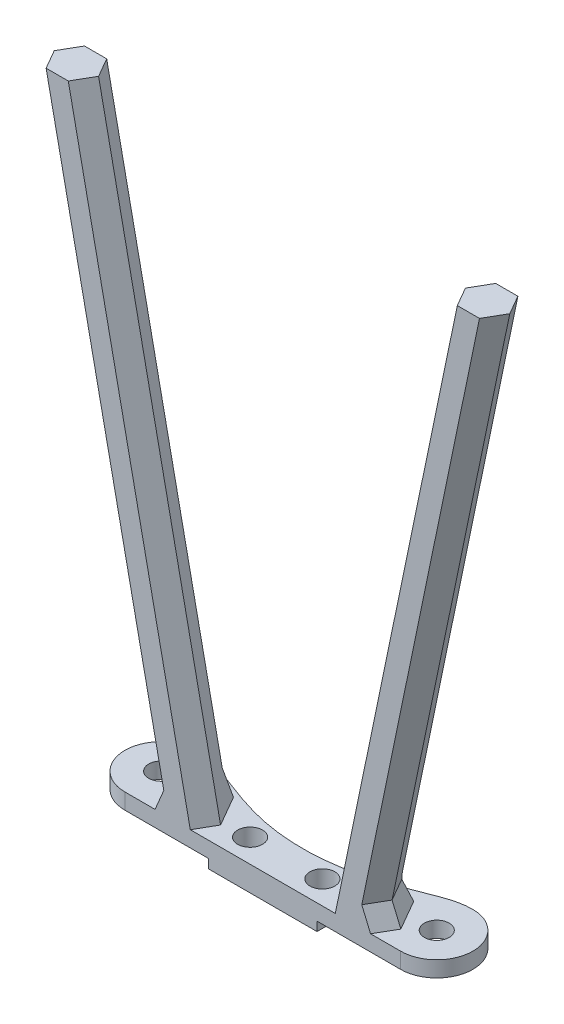
ISO-10303-21;
HEADER;
FILE_DESCRIPTION(('STEP AP214'),'2;1');
FILE_NAME('part.step','',(''),(''),'','','');
FILE_SCHEMA(('AUTOMOTIVE_DESIGN { 1 0 10303 214 1 1 1 1 }'));
ENDSEC;
DATA;
#1=APPLICATION_CONTEXT('core data for automotive mechanical design processes');
#2=APPLICATION_PROTOCOL_DEFINITION('international standard','automotive_design',2000,#1);
#3=PRODUCT_CONTEXT('',#1,'mechanical');
#4=PRODUCT('Part','Part','',(#3));
#5=PRODUCT_RELATED_PRODUCT_CATEGORY('part','',(#4));
#6=PRODUCT_DEFINITION_FORMATION('','',#4);
#7=PRODUCT_DEFINITION_CONTEXT('part definition',#1,'design');
#8=PRODUCT_DEFINITION('design','',#6,#7);
#9=PRODUCT_DEFINITION_SHAPE('','',#8);
#10=(LENGTH_UNIT() NAMED_UNIT(*) SI_UNIT(.MILLI.,.METRE.));
#11=(NAMED_UNIT(*) PLANE_ANGLE_UNIT() SI_UNIT($,.RADIAN.));
#12=(NAMED_UNIT(*) SI_UNIT($,.STERADIAN.) SOLID_ANGLE_UNIT());
#13=UNCERTAINTY_MEASURE_WITH_UNIT(LENGTH_MEASURE(1.E-05),#10,'distance_accuracy_value','');
#14=(GEOMETRIC_REPRESENTATION_CONTEXT(3) GLOBAL_UNCERTAINTY_ASSIGNED_CONTEXT((#13)) GLOBAL_UNIT_ASSIGNED_CONTEXT((#10,
#11,#12)) REPRESENTATION_CONTEXT('',''));
#15=CARTESIAN_POINT('',(0.,0.,0.));
#16=DIRECTION('',(0.,0.,1.));
#17=DIRECTION('',(1.,0.,0.));
#18=AXIS2_PLACEMENT_3D('',#15,#16,#17);
#19=CARTESIAN_POINT('',(0.,0.,0.));
#20=DIRECTION('',(0.,1.00000000000001,0.));
#21=DIRECTION('',(0.,0.,1.));
#22=AXIS2_PLACEMENT_3D('',#19,#20,#21);
#23=PLANE('',#22);
#24=CARTESIAN_POINT('',(30.5000000000002,0.,0.));
#25=DIRECTION('',(0.,1.00000000000001,0.));
#26=DIRECTION('',(0.,0.,1.));
#27=AXIS2_PLACEMENT_3D('',#24,#25,#26);
#28=CIRCLE('',#27,1.375);
#29=CARTESIAN_POINT('',(30.5000000000002,0.,1.375));
#30=VERTEX_POINT('',#29);
#31=EDGE_CURVE('E552',#30,#30,#28,.T.);
#32=ORIENTED_EDGE('',*,*,#31,.T.);
#33=EDGE_LOOP('',(#32));
#34=FACE_BOUND('',#33,.T.);
#35=DIRECTION('',(0.,0.,1.));
#36=VECTOR('',#35,1.);
#37=CARTESIAN_POINT('',(21.2500000000001,0.,4.));
#38=LINE('',#37,#36);
#39=CARTESIAN_POINT('',(21.2500000022778,0.,-1.18515930909376));
#40=VERTEX_POINT('',#39);
#41=CARTESIAN_POINT('',(21.25,0.,4.));
#42=VERTEX_POINT('',#41);
#43=EDGE_CURVE('E259',#40,#42,#38,.T.);
#44=ORIENTED_EDGE('',*,*,#43,.F.);
#45=CARTESIAN_POINT('',(0.,0.,-4.));
#46=CARTESIAN_POINT('',(1.39255410455017,0.,-4.));
#47=CARTESIAN_POINT('',(4.71281611874443,0.,-2.73030225078324));
#48=CARTESIAN_POINT('',(11.20008630874,0.,-0.212313893075119));
#49=CARTESIAN_POINT('',(19.2746966248634,0.,-0.212313893075119));
#50=CARTESIAN_POINT('',(25.8425779606497,0.,-2.73030225078324));
#51=CARTESIAN_POINT('',(29.028765437006,0.,-4.));
#52=CARTESIAN_POINT('',(30.5000000000002,0.,-4.));
#53=B_SPLINE_CURVE_WITH_KNOTS('',3,(#45,#46,#47,#48,#49,#50,#51,#52),.UNSPECIFIED.,.F.,.F.,(4,1,
1,1,1,4),(0.,0.131328662270549,0.332777634257892,0.667222365742108,0.868671337729451,1.),.UNSPECIFIED.);
#54=CARTESIAN_POINT('',(30.5000000000002,0.,-4.));
#55=VERTEX_POINT('',#54);
#56=EDGE_CURVE('E532',#40,#55,#53,.T.);
#57=ORIENTED_EDGE('',*,*,#56,.T.);
#58=CARTESIAN_POINT('',(30.5000000000002,0.,0.));
#59=DIRECTION('',(0.,1.00000000000001,0.));
#60=DIRECTION('',(0.,0.,1.));
#61=AXIS2_PLACEMENT_3D('',#58,#59,#60);
#62=CIRCLE('',#61,4.);
#63=CARTESIAN_POINT('',(30.5000000000002,0.,4.));
#64=VERTEX_POINT('',#63);
#65=EDGE_CURVE('E498',#64,#55,#62,.T.);
#66=ORIENTED_EDGE('',*,*,#65,.F.);
#67=DIRECTION('',(1.00000000000001,0.,0.));
#68=VECTOR('',#67,1.);
#69=CARTESIAN_POINT('',(0.,0.,4.));
#70=LINE('',#69,#68);
#71=EDGE_CURVE('E89',#42,#64,#70,.T.);
#72=ORIENTED_EDGE('',*,*,#71,.F.);
#73=EDGE_LOOP('',(#44,#57,#66,#72));
#74=FACE_BOUND('',#73,.T.);
#75=ADVANCED_FACE('F69',(#34,#74),#23,.F.);
#76=CARTESIAN_POINT('',(0.,0.,0.));
#77=DIRECTION('',(0.,1.00000000000001,0.));
#78=DIRECTION('',(0.,0.,1.));
#79=AXIS2_PLACEMENT_3D('',#76,#77,#78);
#80=CIRCLE('',#79,1.375);
#81=CARTESIAN_POINT('',(0.,0.,1.375));
#82=VERTEX_POINT('',#81);
#83=EDGE_CURVE('E569',#82,#82,#80,.T.);
#84=ORIENTED_EDGE('',*,*,#83,.T.);
#85=EDGE_LOOP('',(#84));
#86=FACE_BOUND('',#85,.T.);
#87=DIRECTION('',(0.,0.,-1.));
#88=VECTOR('',#87,1.);
#89=CARTESIAN_POINT('',(9.25000000000004,0.,4.));
#90=LINE('',#89,#88);
#91=CARTESIAN_POINT('',(9.25000000000026,0.,4.));
#92=VERTEX_POINT('',#91);
#93=CARTESIAN_POINT('',(9.25000000000049,0.,-1.18670499105833));
#94=VERTEX_POINT('',#93);
#95=EDGE_CURVE('E97',#92,#94,#90,.T.);
#96=ORIENTED_EDGE('',*,*,#95,.F.);
#97=CARTESIAN_POINT('',(0.,0.,4.));
#98=VERTEX_POINT('',#97);
#99=EDGE_CURVE('E263',#98,#92,#70,.T.);
#100=ORIENTED_EDGE('',*,*,#99,.F.);
#101=CARTESIAN_POINT('',(0.,0.,0.));
#102=DIRECTION('',(0.,1.00000000000001,0.));
#103=DIRECTION('',(0.,0.,1.));
#104=AXIS2_PLACEMENT_3D('',#101,#102,#103);
#105=CIRCLE('',#104,4.);
#106=CARTESIAN_POINT('',(0.,0.,-4.));
#107=VERTEX_POINT('',#106);
#108=EDGE_CURVE('E509',#107,#98,#105,.T.);
#109=ORIENTED_EDGE('',*,*,#108,.F.);
#110=EDGE_CURVE('E535',#107,#94,#53,.T.);
#111=ORIENTED_EDGE('',*,*,#110,.T.);
#112=EDGE_LOOP('',(#96,#100,#109,#111));
#113=FACE_BOUND('',#112,.T.);
#114=ADVANCED_FACE('F551',(#86,#113),#23,.F.);
#115=CARTESIAN_POINT('',(0.,1.75,0.));
#116=DIRECTION('',(0.,1.00000000000001,0.));
#117=DIRECTION('',(0.,0.,1.));
#118=AXIS2_PLACEMENT_3D('',#115,#116,#117);
#119=PLANE('',#118);
#120=CARTESIAN_POINT('',(11.2499999958525,1.75,1.40677631135101));
#121=DIRECTION('',(0.,1.00000000000001,0.));
#122=DIRECTION('',(0.,0.,1.));
#123=AXIS2_PLACEMENT_3D('',#120,#121,#122);
#124=CIRCLE('',#123,1.375);
#125=CARTESIAN_POINT('',(11.2499999958525,1.75,2.781776311351));
#126=VERTEX_POINT('',#125);
#127=EDGE_CURVE('E554',#126,#126,#124,.T.);
#128=ORIENTED_EDGE('',*,*,#127,.F.);
#129=EDGE_LOOP('',(#128));
#130=FACE_BOUND('',#129,.T.);
#131=CARTESIAN_POINT('',(19.2500000041476,1.75,1.4072915388733));
#132=DIRECTION('',(0.,1.00000000000001,0.));
#133=DIRECTION('',(0.,0.,1.));
#134=AXIS2_PLACEMENT_3D('',#131,#132,#133);
#135=CIRCLE('',#134,1.375);
#136=CARTESIAN_POINT('',(19.2500000041476,1.75,2.7822915388733));
#137=VERTEX_POINT('',#136);
#138=EDGE_CURVE('E610',#137,#137,#135,.T.);
#139=ORIENTED_EDGE('',*,*,#138,.F.);
#140=EDGE_LOOP('',(#139));
#141=FACE_BOUND('',#140,.T.);
#142=CARTESIAN_POINT('',(0.,1.75,0.));
#143=DIRECTION('',(0.,1.00000000000001,0.));
#144=DIRECTION('',(0.,0.,1.));
#145=AXIS2_PLACEMENT_3D('',#142,#143,#144);
#146=CIRCLE('',#145,1.375);
#147=CARTESIAN_POINT('',(0.,1.75,1.375));
#148=VERTEX_POINT('',#147);
#149=EDGE_CURVE('E511',#148,#148,#146,.T.);
#150=ORIENTED_EDGE('',*,*,#149,.F.);
#151=EDGE_LOOP('',(#150));
#152=FACE_BOUND('',#151,.T.);
#153=CARTESIAN_POINT('',(30.5000000000002,1.75,0.));
#154=DIRECTION('',(0.,1.00000000000001,0.));
#155=DIRECTION('',(0.,0.,1.));
#156=AXIS2_PLACEMENT_3D('',#153,#154,#155);
#157=CIRCLE('',#156,1.375);
#158=CARTESIAN_POINT('',(30.5000000000002,1.75,1.375));
#159=VERTEX_POINT('',#158);
#160=EDGE_CURVE('E562',#159,#159,#157,.T.);
#161=ORIENTED_EDGE('',*,*,#160,.F.);
#162=EDGE_LOOP('',(#161));
#163=FACE_BOUND('',#162,.T.);
#164=DIRECTION('',(0.500000000000003,0.,-0.866025403784439));
#165=VECTOR('',#164,1.);
#166=CARTESIAN_POINT('',(22.0462613559442,1.75,1.875));
#167=LINE('',#166,#165);
#168=CARTESIAN_POINT('',(22.0462613559442,1.75,1.87500000000001));
#169=VERTEX_POINT('',#168);
#170=CARTESIAN_POINT('',(23.9948185144593,1.75,-1.5));
#171=VERTEX_POINT('',#170);
#172=EDGE_CURVE('E412',#169,#171,#167,.T.);
#173=ORIENTED_EDGE('',*,*,#172,.T.);
#174=DIRECTION('',(1.00000000000001,0.,0.));
#175=VECTOR('',#174,1.);
#176=CARTESIAN_POINT('',(0.,1.75,-1.50000000000001));
#177=LINE('',#176,#175);
#178=CARTESIAN_POINT('',(26.4485571585151,1.75,-1.5));
#179=VERTEX_POINT('',#178);
#180=EDGE_CURVE('E950',#171,#179,#177,.T.);
#181=ORIENTED_EDGE('',*,*,#180,.T.);
#182=DIRECTION('',(0.500000000000003,0.,0.866025403784439));
#183=VECTOR('',#182,1.);
#184=CARTESIAN_POINT('',(20.4859369217246,1.75,-11.8275611963594));
#185=LINE('',#184,#183);
#186=CARTESIAN_POINT('',(28.3971143170301,1.75,1.87499999999999));
#187=VERTEX_POINT('',#186);
#188=EDGE_CURVE('E952',#179,#187,#185,.T.);
#189=ORIENTED_EDGE('',*,*,#188,.T.);
#190=DIRECTION('',(-0.500000000000003,0.,0.866025403784439));
#191=VECTOR('',#190,1.);
#192=CARTESIAN_POINT('',(22.1097345538205,1.75,12.7650611963594));
#193=LINE('',#192,#191);
#194=CARTESIAN_POINT('',(27.1702449950022,1.75,4.));
#195=VERTEX_POINT('',#194);
#196=EDGE_CURVE('E404',#187,#195,#193,.T.);
#197=ORIENTED_EDGE('',*,*,#196,.T.);
#198=DIRECTION('',(1.00000000000001,0.,0.));
#199=VECTOR('',#198,1.);
#200=CARTESIAN_POINT('',(0.,1.75,4.));
#201=LINE('',#200,#199);
#202=CARTESIAN_POINT('',(30.5000000000002,1.75,4.));
#203=VERTEX_POINT('',#202);
#204=EDGE_CURVE('E425',#195,#203,#201,.T.);
#205=ORIENTED_EDGE('',*,*,#204,.T.);
#206=CARTESIAN_POINT('',(30.5000000000002,1.75,0.));
#207=DIRECTION('',(0.,1.00000000000001,0.));
#208=DIRECTION('',(0.,0.,1.));
#209=AXIS2_PLACEMENT_3D('',#206,#207,#208);
#210=CIRCLE('',#209,4.);
#211=CARTESIAN_POINT('',(30.5000000000002,1.75,-4.));
#212=VERTEX_POINT('',#211);
#213=EDGE_CURVE('E506',#203,#212,#210,.T.);
#214=ORIENTED_EDGE('',*,*,#213,.T.);
#215=CARTESIAN_POINT('',(0.,1.75,-4.));
#216=CARTESIAN_POINT('',(1.39255410455017,1.75,-4.));
#217=CARTESIAN_POINT('',(4.71281611874443,1.75,-2.73030225078324));
#218=CARTESIAN_POINT('',(11.20008630874,1.75,-0.212313893075119));
#219=CARTESIAN_POINT('',(19.2746966248634,1.75,-0.212313893075119));
#220=CARTESIAN_POINT('',(25.8425779606497,1.75,-2.73030225078324));
#221=CARTESIAN_POINT('',(29.028765437006,1.75,-4.));
#222=CARTESIAN_POINT('',(30.5000000000002,1.75,-4.));
#223=B_SPLINE_CURVE_WITH_KNOTS('',3,(#215,#216,#217,#218,#219,#220,#221,#222),.UNSPECIFIED.,.F.,
.F.,(4,1,1,1,1,4),(0.,0.131328662270549,0.332777634257892,0.667222365742108,0.868671337729451,
1.),.UNSPECIFIED.);
#224=CARTESIAN_POINT('',(0.,1.75,-4.));
#225=VERTEX_POINT('',#224);
#226=EDGE_CURVE('E536',#225,#212,#223,.T.);
#227=ORIENTED_EDGE('',*,*,#226,.F.);
#228=CARTESIAN_POINT('',(0.,1.75,0.));
#229=DIRECTION('',(0.,1.00000000000001,0.));
#230=DIRECTION('',(0.,0.,1.));
#231=AXIS2_PLACEMENT_3D('',#228,#229,#230);
#232=CIRCLE('',#231,4.);
#233=CARTESIAN_POINT('',(0.,1.75,4.));
#234=VERTEX_POINT('',#233);
#235=EDGE_CURVE('E501',#225,#234,#232,.T.);
#236=ORIENTED_EDGE('',*,*,#235,.T.);
#237=CARTESIAN_POINT('',(3.32975500499799,1.75,4.));
#238=VERTEX_POINT('',#237);
#239=EDGE_CURVE('E514',#234,#238,#201,.T.);
#240=ORIENTED_EDGE('',*,*,#239,.T.);
#241=DIRECTION('',(-0.500000000000003,0.,-0.866025403784439));
#242=VECTOR('',#241,1.);
#243=CARTESIAN_POINT('',(0.76526544617961,1.75,-0.441826211353316));
#244=LINE('',#243,#242);
#245=CARTESIAN_POINT('',(2.10288568297003,1.75,1.875));
#246=VERTEX_POINT('',#245);
#247=EDGE_CURVE('E476',#238,#246,#244,.T.);
#248=ORIENTED_EDGE('',*,*,#247,.T.);
#249=DIRECTION('',(0.500000000000003,0.,-0.866025403784439));
#250=VECTOR('',#249,1.);
#251=CARTESIAN_POINT('',(2.38906307827543,1.75,1.37932621135332));
#252=LINE('',#251,#250);
#253=CARTESIAN_POINT('',(4.05144284148506,1.75,-1.5));
#254=VERTEX_POINT('',#253);
#255=EDGE_CURVE('E474',#246,#254,#252,.T.);
#256=ORIENTED_EDGE('',*,*,#255,.T.);
#257=DIRECTION('',(1.00000000000001,0.,0.));
#258=VECTOR('',#257,1.);
#259=CARTESIAN_POINT('',(0.,1.75,-1.5));
#260=LINE('',#259,#258);
#261=CARTESIAN_POINT('',(6.50518148554096,1.75,-1.5));
#262=VERTEX_POINT('',#261);
#263=EDGE_CURVE('E471',#254,#262,#260,.T.);
#264=ORIENTED_EDGE('',*,*,#263,.T.);
#265=DIRECTION('',(-0.500000000000003,0.,-0.866025403784438));
#266=VECTOR('',#265,1.);
#267=CARTESIAN_POINT('',(8.45373864405595,1.75,1.87500000000001));
#268=LINE('',#267,#266);
#269=CARTESIAN_POINT('',(8.45373864405595,1.75,1.87500000000001));
#270=VERTEX_POINT('',#269);
#271=EDGE_CURVE('E925',#270,#262,#268,.T.);
#272=ORIENTED_EDGE('',*,*,#271,.F.);
#273=DIRECTION('',(0.500000000000004,0.,-0.866025403784438));
#274=VECTOR('',#273,1.);
#275=CARTESIAN_POINT('',(7.226869322028,1.75,4.));
#276=LINE('',#275,#274);
#277=CARTESIAN_POINT('',(7.226869322028,1.75,4.));
#278=VERTEX_POINT('',#277);
#279=EDGE_CURVE('E411',#278,#270,#276,.T.);
#280=ORIENTED_EDGE('',*,*,#279,.F.);
#281=CARTESIAN_POINT('',(23.2731306779721,1.75,4.));
#282=VERTEX_POINT('',#281);
#283=EDGE_CURVE('E517',#278,#282,#201,.T.);
#284=ORIENTED_EDGE('',*,*,#283,.T.);
#285=DIRECTION('',(-0.500000000000004,0.,-0.866025403784438));
#286=VECTOR('',#285,1.);
#287=CARTESIAN_POINT('',(23.2731306779721,1.75,4.00000000000001));
#288=LINE('',#287,#286);
#289=EDGE_CURVE('E415',#282,#169,#288,.T.);
#290=ORIENTED_EDGE('',*,*,#289,.T.);
#291=EDGE_LOOP('',(#173,#181,#189,#197,#205,#214,#227,#236,#240,#248,#256,#264,#272,#280,#284,#290));
#292=FACE_BOUND('',#291,.T.);
#293=ADVANCED_FACE('F545',(#130,#141,#152,#163,#292),#119,.T.);
#294=CARTESIAN_POINT('',(0.,1.75,0.));
#295=DIRECTION('',(0.,-1.00000000000001,0.));
#296=DIRECTION('',(0.,0.,-1.));
#297=AXIS2_PLACEMENT_3D('',#294,#295,#296);
#298=CYLINDRICAL_SURFACE('',#297,4.);
#299=ORIENTED_EDGE('',*,*,#108,.T.);
#300=DIRECTION('',(0.,-1.00000000000001,0.));
#301=VECTOR('',#300,1.);
#302=CARTESIAN_POINT('',(0.,1.75,4.));
#303=LINE('',#302,#301);
#304=EDGE_CURVE('E479',#234,#98,#303,.T.);
#305=ORIENTED_EDGE('',*,*,#304,.F.);
#306=ORIENTED_EDGE('',*,*,#235,.F.);
#307=DIRECTION('',(0.,-1.00000000000001,0.));
#308=VECTOR('',#307,1.);
#309=CARTESIAN_POINT('',(0.,1.75,-4.));
#310=LINE('',#309,#308);
#311=EDGE_CURVE('E495',#225,#107,#310,.T.);
#312=ORIENTED_EDGE('',*,*,#311,.T.);
#313=EDGE_LOOP('',(#299,#305,#306,#312));
#314=FACE_BOUND('',#313,.T.);
#315=ADVANCED_FACE('F438',(#314),#298,.T.);
#316=CARTESIAN_POINT('',(0.,1.75,4.));
#317=DIRECTION('',(0.,0.,-1.));
#318=DIRECTION('',(-1.00000000000001,0.,0.));
#319=AXIS2_PLACEMENT_3D('',#316,#317,#318);
#320=PLANE('',#319);
#321=ORIENTED_EDGE('',*,*,#99,.T.);
#322=DIRECTION('',(0.,1.00000000000001,0.));
#323=VECTOR('',#322,1.);
#324=CARTESIAN_POINT('',(9.25000000000004,-1.00000000000001,4.));
#325=LINE('',#324,#323);
#326=CARTESIAN_POINT('',(9.25000000000004,-1.00000000000001,4.));
#327=VERTEX_POINT('',#326);
#328=EDGE_CURVE('E244',#327,#92,#325,.T.);
#329=ORIENTED_EDGE('',*,*,#328,.F.);
#330=DIRECTION('',(-1.00000000000001,0.,0.));
#331=VECTOR('',#330,1.);
#332=CARTESIAN_POINT('',(9.25000000000004,-1.00000000000001,4.));
#333=LINE('',#332,#331);
#334=CARTESIAN_POINT('',(21.2500000000001,-1.00000000000001,4.));
#335=VERTEX_POINT('',#334);
#336=EDGE_CURVE('E250',#335,#327,#333,.T.);
#337=ORIENTED_EDGE('',*,*,#336,.F.);
#338=DIRECTION('',(0.,1.00000000000001,0.));
#339=VECTOR('',#338,1.);
#340=CARTESIAN_POINT('',(21.2500000000001,-1.00000000000001,4.));
#341=LINE('',#340,#339);
#342=EDGE_CURVE('E272',#335,#42,#341,.T.);
#343=ORIENTED_EDGE('',*,*,#342,.T.);
#344=ORIENTED_EDGE('',*,*,#71,.T.);
#345=DIRECTION('',(0.,-1.00000000000001,0.));
#346=VECTOR('',#345,1.);
#347=CARTESIAN_POINT('',(30.5000000000002,1.75,4.));
#348=LINE('',#347,#346);
#349=EDGE_CURVE('E484',#203,#64,#348,.T.);
#350=ORIENTED_EDGE('',*,*,#349,.F.);
#351=ORIENTED_EDGE('',*,*,#204,.F.);
#352=DIRECTION('',(-0.387449252410569,0.921891033043767,0.));
#353=VECTOR('',#352,1.);
#354=CARTESIAN_POINT('',(23.0915314139386,11.4548308993813,4.));
#355=LINE('',#354,#353);
#356=CARTESIAN_POINT('',(26.2042464796552,4.04848261079698,4.));
#357=VERTEX_POINT('',#356);
#358=EDGE_CURVE('E12',#195,#357,#355,.T.);
#359=ORIENTED_EDGE('',*,*,#358,.T.);
#360=DIRECTION('',(0.20335269165813,0.979105552428034,0.));
#361=VECTOR('',#360,1.);
#362=CARTESIAN_POINT('',(25.7268693220281,1.75,4.));
#363=LINE('',#362,#361);
#364=CARTESIAN_POINT('',(39.2268693220282,66.7500000000004,4.));
#365=VERTEX_POINT('',#364);
#366=EDGE_CURVE('E937',#357,#365,#363,.T.);
#367=ORIENTED_EDGE('',*,*,#366,.T.);
#368=CARTESIAN_POINT('',(39.2268693220282,66.7500000000003,4.));
#369=DIRECTION('',(-1.,0.,0.));
#370=VECTOR('',#369,1.);
#371=LINE('',#368,#370);
#372=CARTESIAN_POINT('',(36.7731306779722,66.7500000000004,4.));
#373=VERTEX_POINT('',#372);
#374=EDGE_CURVE('E325',#365,#373,#371,.T.);
#375=ORIENTED_EDGE('',*,*,#374,.T.);
#376=DIRECTION('',(0.20335269165813,0.979105552428034,0.));
#377=VECTOR('',#376,1.);
#378=CARTESIAN_POINT('',(23.2731306779721,1.75,4.));
#379=LINE('',#378,#377);
#380=EDGE_CURVE('E414',#282,#373,#379,.T.);
#381=ORIENTED_EDGE('',*,*,#380,.F.);
#382=ORIENTED_EDGE('',*,*,#283,.F.);
#383=DIRECTION('',(-0.20335269165813,0.979105552428034,0.));
#384=VECTOR('',#383,1.);
#385=CARTESIAN_POINT('',(7.226869322028,1.75,4.));
#386=LINE('',#385,#384);
#387=CARTESIAN_POINT('',(-6.27313067797205,66.7500000000004,4.));
#388=VERTEX_POINT('',#387);
#389=EDGE_CURVE('E386',#278,#388,#386,.T.);
#390=ORIENTED_EDGE('',*,*,#389,.T.);
#391=DIRECTION('',(1.00000000000001,0.,0.));
#392=VECTOR('',#391,1.);
#393=CARTESIAN_POINT('',(-8.72686932202804,66.7500000000004,4.));
#394=LINE('',#393,#392);
#395=CARTESIAN_POINT('',(-8.72686932202804,66.7500000000004,4.));
#396=VERTEX_POINT('',#395);
#397=EDGE_CURVE('E543',#396,#388,#394,.T.);
#398=ORIENTED_EDGE('',*,*,#397,.F.);
#399=DIRECTION('',(-0.20335269165813,0.979105552428034,0.));
#400=VECTOR('',#399,1.);
#401=CARTESIAN_POINT('',(4.77313067797209,1.75,4.));
#402=LINE('',#401,#400);
#403=CARTESIAN_POINT('',(4.29575352034503,4.04848261079699,4.));
#404=VERTEX_POINT('',#403);
#405=EDGE_CURVE('E389',#404,#396,#402,.T.);
#406=ORIENTED_EDGE('',*,*,#405,.F.);
#407=DIRECTION('',(-0.387449252410573,-0.921891033043765,0.));
#408=VECTOR('',#407,1.);
#409=CARTESIAN_POINT('',(2.8299024286595,0.560658156898534,4.));
#410=LINE('',#409,#408);
#411=EDGE_CURVE('E402',#404,#238,#410,.T.);
#412=ORIENTED_EDGE('',*,*,#411,.T.);
#413=ORIENTED_EDGE('',*,*,#239,.F.);
#414=ORIENTED_EDGE('',*,*,#304,.T.);
#415=EDGE_LOOP('',(#321,#329,#337,#343,#344,#350,#351,#359,#367,#375,#381,#382,#390,#398,#406,
#412,#413,#414));
#416=FACE_BOUND('',#415,.T.);
#417=ADVANCED_FACE('F261',(#416),#320,.F.);
#418=CARTESIAN_POINT('',(30.5000000000002,1.75,0.));
#419=DIRECTION('',(0.,-1.00000000000001,0.));
#420=DIRECTION('',(0.,0.,-1.));
#421=AXIS2_PLACEMENT_3D('',#418,#419,#420);
#422=CYLINDRICAL_SURFACE('',#421,4.);
#423=ORIENTED_EDGE('',*,*,#65,.T.);
#424=DIRECTION('',(0.,-1.00000000000001,0.));
#425=VECTOR('',#424,1.);
#426=CARTESIAN_POINT('',(30.5000000000002,1.75,-4.));
#427=LINE('',#426,#425);
#428=EDGE_CURVE('E489',#212,#55,#427,.T.);
#429=ORIENTED_EDGE('',*,*,#428,.F.);
#430=ORIENTED_EDGE('',*,*,#213,.F.);
#431=ORIENTED_EDGE('',*,*,#349,.T.);
#432=EDGE_LOOP('',(#423,#429,#430,#431));
#433=FACE_BOUND('',#432,.T.);
#434=ADVANCED_FACE('F437',(#433),#422,.T.);
#435=CARTESIAN_POINT('',(0.,1.75,0.));
#436=DIRECTION('',(0.,-1.00000000000001,0.));
#437=DIRECTION('',(0.,0.,-1.));
#438=AXIS2_PLACEMENT_3D('',#435,#436,#437);
#439=CYLINDRICAL_SURFACE('',#438,1.375);
#440=ORIENTED_EDGE('',*,*,#149,.T.);
#441=EDGE_LOOP('',(#440));
#442=FACE_BOUND('',#441,.T.);
#443=ORIENTED_EDGE('',*,*,#83,.F.);
#444=EDGE_LOOP('',(#443));
#445=FACE_BOUND('',#444,.T.);
#446=ADVANCED_FACE('F577',(#442,#445),#439,.F.);
#447=CARTESIAN_POINT('',(30.5000000000002,1.75,0.));
#448=DIRECTION('',(0.,-1.00000000000001,0.));
#449=DIRECTION('',(0.,0.,-1.));
#450=AXIS2_PLACEMENT_3D('',#447,#448,#449);
#451=CYLINDRICAL_SURFACE('',#450,1.375);
#452=ORIENTED_EDGE('',*,*,#160,.T.);
#453=EDGE_LOOP('',(#452));
#454=FACE_BOUND('',#453,.T.);
#455=ORIENTED_EDGE('',*,*,#31,.F.);
#456=EDGE_LOOP('',(#455));
#457=FACE_BOUND('',#456,.T.);
#458=ADVANCED_FACE('F579',(#454,#457),#451,.F.);
#459=CARTESIAN_POINT('',(0.,-8.25000000000005,-4.));
#460=CARTESIAN_POINT('',(1.39255410455017,-8.25000000000005,-4.));
#461=CARTESIAN_POINT('',(4.71281611874443,-8.25000000000005,-2.73030225078324));
#462=CARTESIAN_POINT('',(11.20008630874,-8.25000000000005,-0.212313893075119));
#463=CARTESIAN_POINT('',(19.2746966248634,-8.25000000000005,-0.212313893075119));
#464=CARTESIAN_POINT('',(25.8425779606497,-8.25000000000005,-2.73030225078324));
#465=CARTESIAN_POINT('',(29.028765437006,-8.25000000000005,-4.));
#466=CARTESIAN_POINT('',(30.5000000000002,-8.25000000000005,-4.));
#467=B_SPLINE_CURVE_WITH_KNOTS('',3,(#459,#460,#461,#462,#463,#464,#465,#466),.UNSPECIFIED.,.F.,
.F.,(4,1,1,1,1,4),(0.,0.131328662270549,0.332777634257892,0.667222365742108,0.868671337729451,
1.),.UNSPECIFIED.);
#468=DIRECTION('',(0.,1.00000000000001,0.));
#469=VECTOR('',#468,1.);
#470=SURFACE_OF_LINEAR_EXTRUSION('',#467,#469);
#471=ORIENTED_EDGE('',*,*,#311,.F.);
#472=ORIENTED_EDGE('',*,*,#226,.T.);
#473=ORIENTED_EDGE('',*,*,#428,.T.);
#474=ORIENTED_EDGE('',*,*,#56,.F.);
#475=DIRECTION('',(0.,1.00000000000001,0.));
#476=VECTOR('',#475,1.);
#477=CARTESIAN_POINT('',(21.2499999999998,-0.500000000000011,-1.18515930849314));
#478=LINE('',#477,#476);
#479=CARTESIAN_POINT('',(21.2499999999996,-1.00000000000001,-1.18515930849306));
#480=VERTEX_POINT('',#479);
#481=EDGE_CURVE('E268',#480,#40,#478,.T.);
#482=ORIENTED_EDGE('',*,*,#481,.F.);
#483=CARTESIAN_POINT('',(21.2499999999996,-1.,-1.18515930849306));
#484=CARTESIAN_POINT('',(21.0011776639862,-1.,-1.11955383888622));
#485=CARTESIAN_POINT('',(17.3367659021272,-1.,-0.212313893075119));
#486=CARTESIAN_POINT('',(13.1359122372325,-1.,-0.212313893075119));
#487=CARTESIAN_POINT('',(9.49875644908349,-1.,-1.12052572867879));
#488=CARTESIAN_POINT('',(9.25000000000063,-1.,-1.18670499105829));
#489=B_SPLINE_CURVE_WITH_KNOTS('',3,(#483,#484,#485,#486,#487,#488),.UNSPECIFIED.,.F.,.F.,(4,1,
1,4),(0.308100916714488,0.33258543246014,0.667030163944357,0.691706881487761),.UNSPECIFIED.);
#490=CARTESIAN_POINT('',(9.25000000000049,-1.00000000000001,-1.18670499105833));
#491=VERTEX_POINT('',#490);
#492=EDGE_CURVE('E249',#491,#480,#489,.F.);
#493=ORIENTED_EDGE('',*,*,#492,.F.);
#494=DIRECTION('',(0.,1.00000000000001,0.));
#495=VECTOR('',#494,1.);
#496=CARTESIAN_POINT('',(9.25000000000048,-0.500000000000011,-1.18670499105834));
#497=LINE('',#496,#495);
#498=EDGE_CURVE('E246',#491,#94,#497,.T.);
#499=ORIENTED_EDGE('',*,*,#498,.T.);
#500=ORIENTED_EDGE('',*,*,#110,.F.);
#501=EDGE_LOOP('',(#471,#472,#473,#474,#482,#493,#499,#500));
#502=FACE_BOUND('',#501,.T.);
#503=ADVANCED_FACE('F538',(#502),#470,.F.);
#504=CARTESIAN_POINT('',(0.,66.7500000000004,0.));
#505=DIRECTION('',(0.,1.00000000000001,0.));
#506=DIRECTION('',(0.,0.,1.));
#507=AXIS2_PLACEMENT_3D('',#504,#505,#506);
#508=PLANE('',#507);
#509=DIRECTION('',(0.500000000000003,0.,-0.866025403784439));
#510=VECTOR('',#509,1.);
#511=CARTESIAN_POINT('',(-6.27313067797205,66.7500000000004,4.));
#512=LINE('',#511,#510);
#513=CARTESIAN_POINT('',(-5.04626135594409,66.7500000000004,1.875));
#514=VERTEX_POINT('',#513);
#515=EDGE_CURVE('E470',#388,#514,#512,.T.);
#516=ORIENTED_EDGE('',*,*,#515,.T.);
#517=DIRECTION('',(-0.500000000000003,0.,-0.866025403784439));
#518=VECTOR('',#517,1.);
#519=CARTESIAN_POINT('',(-5.04626135594409,66.7500000000004,1.875));
#520=LINE('',#519,#518);
#521=CARTESIAN_POINT('',(-6.27313067797205,66.7500000000004,-0.250000000000004));
#522=VERTEX_POINT('',#521);
#523=EDGE_CURVE('E850',#514,#522,#520,.T.);
#524=ORIENTED_EDGE('',*,*,#523,.T.);
#525=DIRECTION('',(-1.00000000000001,0.,0.));
#526=VECTOR('',#525,1.);
#527=CARTESIAN_POINT('',(-6.27313067797205,66.7500000000004,-0.25));
#528=LINE('',#527,#526);
#529=CARTESIAN_POINT('',(-8.72686932202804,66.7500000000004,-0.25));
#530=VERTEX_POINT('',#529);
#531=EDGE_CURVE('E857',#522,#530,#528,.T.);
#532=ORIENTED_EDGE('',*,*,#531,.T.);
#533=DIRECTION('',(-0.500000000000003,0.,0.866025403784439));
#534=VECTOR('',#533,1.);
#535=CARTESIAN_POINT('',(-8.72686932202804,66.7500000000004,-0.25));
#536=LINE('',#535,#534);
#537=CARTESIAN_POINT('',(-9.95373864405599,66.7500000000004,1.875));
#538=VERTEX_POINT('',#537);
#539=EDGE_CURVE('E861',#530,#538,#536,.T.);
#540=ORIENTED_EDGE('',*,*,#539,.T.);
#541=DIRECTION('',(0.500000000000003,0.,0.866025403784438));
#542=VECTOR('',#541,1.);
#543=CARTESIAN_POINT('',(-9.95373864405599,66.7500000000004,1.875));
#544=LINE('',#543,#542);
#545=EDGE_CURVE('E903',#538,#396,#544,.T.);
#546=ORIENTED_EDGE('',*,*,#545,.T.);
#547=ORIENTED_EDGE('',*,*,#397,.T.);
#548=EDGE_LOOP('',(#516,#524,#532,#540,#546,#547));
#549=FACE_BOUND('',#548,.T.);
#550=ADVANCED_FACE('F657',(#549),#508,.T.);
#551=CARTESIAN_POINT('',(2.05394401223045,0.42658837177094,-1.18584512836167));
#552=DIRECTION('',(0.85234754581666,0.177026028746537,-0.492103085020362));
#553=DIRECTION('',(-0.500000000000003,0.,-0.866025403784439));
#554=AXIS2_PLACEMENT_3D('',#551,#552,#553);
#555=PLANE('',#554);
#556=DIRECTION('',(-0.20335269165813,0.979105552428034,0.));
#557=VECTOR('',#556,1.);
#558=CARTESIAN_POINT('',(3.54626135594413,1.75,1.875));
#559=LINE('',#558,#557);
#560=CARTESIAN_POINT('',(3.06888419831703,4.04848261079699,1.875));
#561=VERTEX_POINT('',#560);
#562=EDGE_CURVE('E457',#561,#538,#559,.T.);
#563=ORIENTED_EDGE('',*,*,#562,.F.);
#564=DIRECTION('',(0.500000000000003,0.,0.866025403784439));
#565=VECTOR('',#564,1.);
#566=CARTESIAN_POINT('',(1.48976433268986,4.04848261079699,-0.860115838507595));
#567=LINE('',#566,#565);
#568=EDGE_CURVE('E395',#561,#404,#567,.T.);
#569=ORIENTED_EDGE('',*,*,#568,.T.);
#570=ORIENTED_EDGE('',*,*,#405,.T.);
#571=ORIENTED_EDGE('',*,*,#545,.F.);
#572=EDGE_LOOP('',(#563,#569,#570,#571));
#573=FACE_BOUND('',#572,.T.);
#574=ADVANCED_FACE('F344',(#573),#555,.F.);
#575=CARTESIAN_POINT('',(7.19211900810289,1.49374779399059,4.152371845372));
#576=DIRECTION('',(-0.85234754581666,-0.177026028746537,-0.492103085020362));
#577=DIRECTION('',(-0.500000000000003,0.,0.866025403784439));
#578=AXIS2_PLACEMENT_3D('',#575,#576,#577);
#579=PLANE('',#578);
#580=DIRECTION('',(-0.20335269165813,0.979105552428034,0.));
#581=VECTOR('',#580,1.);
#582=CARTESIAN_POINT('',(8.45373864405595,1.75,1.87500000000001));
#583=LINE('',#582,#581);
#584=EDGE_CURVE('E392',#270,#514,#583,.T.);
#585=ORIENTED_EDGE('',*,*,#584,.T.);
#586=ORIENTED_EDGE('',*,*,#515,.F.);
#587=ORIENTED_EDGE('',*,*,#389,.F.);
#588=ORIENTED_EDGE('',*,*,#279,.T.);
#589=EDGE_LOOP('',(#585,#586,#587,#588));
#590=FACE_BOUND('',#589,.T.);
#591=ADVANCED_FACE('F768',(#590),#579,.F.);
#592=CARTESIAN_POINT('',(5.61920829508072,1.16706633820906,-3.24425142179741));
#593=DIRECTION('',(-0.85234754581666,-0.177026028746536,0.492103085020362));
#594=DIRECTION('',(0.500000000000003,0.,0.866025403784439));
#595=AXIS2_PLACEMENT_3D('',#592,#593,#594);
#596=PLANE('',#595);
#597=ORIENTED_EDGE('',*,*,#271,.T.);
#598=DIRECTION('',(0.0022984868133625,0.93969013856502,0.342019239871141));
#599=VECTOR('',#598,1.);
#600=CARTESIAN_POINT('',(6.50254654402925,0.672757120095834,-1.89208434336031));
#601=LINE('',#600,#599);
#602=CARTESIAN_POINT('',(6.51358191505418,5.18434677431839,-0.25));
#603=VERTEX_POINT('',#602);
#604=EDGE_CURVE('E400',#262,#603,#601,.T.);
#605=ORIENTED_EDGE('',*,*,#604,.T.);
#606=DIRECTION('',(-0.20335269165813,0.979105552428034,0.));
#607=VECTOR('',#606,1.);
#608=CARTESIAN_POINT('',(7.226869322028,1.75,-0.249999999999997));
#609=LINE('',#608,#607);
#610=EDGE_CURVE('E458',#603,#522,#609,.T.);
#611=ORIENTED_EDGE('',*,*,#610,.T.);
#612=ORIENTED_EDGE('',*,*,#523,.F.);
#613=ORIENTED_EDGE('',*,*,#584,.F.);
#614=EDGE_LOOP('',(#597,#605,#611,#612,#613));
#615=FACE_BOUND('',#614,.T.);
#616=ADVANCED_FACE('F761',(#615),#596,.F.);
#617=CARTESIAN_POINT('',(0.,0.,-0.249999999999997));
#618=DIRECTION('',(0.,0.,1.));
#619=DIRECTION('',(1.00000000000001,0.,0.));
#620=AXIS2_PLACEMENT_3D('',#617,#618,#619);
#621=PLANE('',#620);
#622=ORIENTED_EDGE('',*,*,#610,.F.);
#623=DIRECTION('',(-1.00000000000001,0.,0.));
#624=VECTOR('',#623,1.);
#625=CARTESIAN_POINT('',(0.,5.18434677431839,-0.249999999999997));
#626=LINE('',#625,#624);
#627=CARTESIAN_POINT('',(4.05984327099828,5.18434677431839,-0.249999999999997));
#628=VERTEX_POINT('',#627);
#629=EDGE_CURVE('E477',#603,#628,#626,.T.);
#630=ORIENTED_EDGE('',*,*,#629,.T.);
#631=DIRECTION('',(-0.20335269165813,0.979105552428034,0.));
#632=VECTOR('',#631,1.);
#633=CARTESIAN_POINT('',(4.77313067797209,1.75,-0.249999999999997));
#634=LINE('',#633,#632);
#635=EDGE_CURVE('E449',#628,#530,#634,.T.);
#636=ORIENTED_EDGE('',*,*,#635,.T.);
#637=ORIENTED_EDGE('',*,*,#531,.F.);
#638=EDGE_LOOP('',(#622,#630,#636,#637));
#639=FACE_BOUND('',#638,.T.);
#640=ADVANCED_FACE('F753',(#639),#621,.F.);
#641=CARTESIAN_POINT('',(3.62685472525266,0.753269827552466,2.09396555193626));
#642=DIRECTION('',(0.85234754581666,0.177026028746537,0.492103085020362));
#643=DIRECTION('',(0.500000000000003,0.,-0.866025403784439));
#644=AXIS2_PLACEMENT_3D('',#641,#642,#643);
#645=PLANE('',#644);
#646=DIRECTION('',(0.365471099843122,-0.874687210509399,-0.318360108918748));
#647=VECTOR('',#646,1.);
#648=CARTESIAN_POINT('',(5.14578085518232,2.58535682215805,-1.19595498174328));
#649=LINE('',#648,#647);
#650=CARTESIAN_POINT('',(4.53444209915856,4.048482610797,-0.663420745691454));
#651=VERTEX_POINT('',#650);
#652=EDGE_CURVE('E397',#628,#651,#649,.T.);
#653=ORIENTED_EDGE('',*,*,#652,.T.);
#654=DIRECTION('',(-0.500000000000003,0.,0.866025403784439));
#655=VECTOR('',#654,1.);
#656=CARTESIAN_POINT('',(3.11356196478568,4.048482610797,1.79761583850759));
#657=LINE('',#656,#655);
#658=EDGE_CURVE('E393',#651,#561,#657,.T.);
#659=ORIENTED_EDGE('',*,*,#658,.T.);
#660=ORIENTED_EDGE('',*,*,#562,.T.);
#661=ORIENTED_EDGE('',*,*,#539,.F.);
#662=ORIENTED_EDGE('',*,*,#635,.F.);
#663=EDGE_LOOP('',(#653,#659,#660,#661,#662));
#664=FACE_BOUND('',#663,.T.);
#665=ADVANCED_FACE('F745',(#664),#645,.F.);
#666=CARTESIAN_POINT('',(1.48976433268986,4.048482610797,-0.860115838507595));
#667=DIRECTION('',(0.813797681349381,-0.342020143325665,-0.469846310392955));
#668=DIRECTION('',(0.500000000000003,0.,0.866025403784439));
#669=AXIS2_PLACEMENT_3D('',#666,#667,#668);
#670=PLANE('',#669);
#671=ORIENTED_EDGE('',*,*,#411,.F.);
#672=ORIENTED_EDGE('',*,*,#568,.F.);
#673=DIRECTION('',(-0.387449252410573,-0.921891033043766,0.));
#674=VECTOR('',#673,1.);
#675=CARTESIAN_POINT('',(2.83183158273533,3.4844431158059,1.875));
#676=LINE('',#675,#674);
#677=EDGE_CURVE('E408',#246,#561,#676,.F.);
#678=ORIENTED_EDGE('',*,*,#677,.F.);
#679=ORIENTED_EDGE('',*,*,#247,.F.);
#680=EDGE_LOOP('',(#671,#672,#678,#679));
#681=FACE_BOUND('',#680,.T.);
#682=ADVANCED_FACE('F737',(#681),#670,.F.);
#683=CARTESIAN_POINT('',(3.11356196478568,4.048482610797,1.79761583850759));
#684=DIRECTION('',(0.813797681349381,-0.342020143325665,0.469846310392955));
#685=DIRECTION('',(-0.500000000000003,0.,0.866025403784439));
#686=AXIS2_PLACEMENT_3D('',#683,#684,#685);
#687=PLANE('',#686);
#688=ORIENTED_EDGE('',*,*,#658,.F.);
#689=DIRECTION('',(-0.193724626205287,-0.921891033043766,-0.335540895264841));
#690=VECTOR('',#689,1.);
#691=CARTESIAN_POINT('',(4.64109117615797,4.55600109047633,-0.478699125748144));
#692=LINE('',#691,#690);
#693=EDGE_CURVE('E405',#254,#651,#692,.F.);
#694=ORIENTED_EDGE('',*,*,#693,.F.);
#695=ORIENTED_EDGE('',*,*,#255,.F.);
#696=ORIENTED_EDGE('',*,*,#677,.T.);
#697=EDGE_LOOP('',(#688,#694,#695,#696));
#698=FACE_BOUND('',#697,.T.);
#699=ADVANCED_FACE('F730',(#698),#687,.F.);
#700=CARTESIAN_POINT('',(0.,5.18434677431839,-0.249999999999997));
#701=DIRECTION('',(0.,-0.342020143325664,0.939692620785911));
#702=DIRECTION('',(-1.00000000000001,0.,0.));
#703=AXIS2_PLACEMENT_3D('',#700,#701,#702);
#704=PLANE('',#703);
#705=ORIENTED_EDGE('',*,*,#604,.F.);
#706=ORIENTED_EDGE('',*,*,#263,.F.);
#707=ORIENTED_EDGE('',*,*,#693,.T.);
#708=ORIENTED_EDGE('',*,*,#652,.F.);
#709=ORIENTED_EDGE('',*,*,#629,.F.);
#710=EDGE_LOOP('',(#705,#706,#707,#708,#709));
#711=FACE_BOUND('',#710,.T.);
#712=ADVANCED_FACE('F340',(#711),#704,.F.);
#713=CARTESIAN_POINT('',(30.5000000000002,66.7500000000004,0.));
#714=DIRECTION('',(0.,1.00000000000001,0.));
#715=DIRECTION('',(0.,0.,1.));
#716=AXIS2_PLACEMENT_3D('',#713,#714,#715);
#717=PLANE('',#716);
#718=CARTESIAN_POINT('',(36.7731306779722,66.7500000000004,3.99999999999994));
#719=DIRECTION('',(-0.500000000000001,0.,-0.866025403784438));
#720=VECTOR('',#719,1.);
#721=LINE('',#718,#720);
#722=CARTESIAN_POINT('',(35.5462613559443,66.7500000000004,1.875));
#723=VERTEX_POINT('',#722);
#724=EDGE_CURVE('E375',#373,#723,#721,.T.);
#725=ORIENTED_EDGE('',*,*,#724,.F.);
#726=ORIENTED_EDGE('',*,*,#374,.F.);
#727=CARTESIAN_POINT('',(40.4537386440561,66.7500000000005,1.87500000000006));
#728=DIRECTION('',(-0.500000000000003,0.,0.866025403784437));
#729=VECTOR('',#728,1.);
#730=LINE('',#727,#729);
#731=CARTESIAN_POINT('',(40.4537386440562,66.7500000000004,1.875));
#732=VERTEX_POINT('',#731);
#733=EDGE_CURVE('E1013',#732,#365,#730,.T.);
#734=ORIENTED_EDGE('',*,*,#733,.F.);
#735=CARTESIAN_POINT('',(39.2268693220282,66.7500000000004,-0.250000000000055));
#736=DIRECTION('',(0.500000000000003,0.,0.866025403784437));
#737=VECTOR('',#736,1.);
#738=LINE('',#735,#737);
#739=CARTESIAN_POINT('',(39.2268693220282,66.7500000000004,-0.25));
#740=VERTEX_POINT('',#739);
#741=EDGE_CURVE('E1009',#740,#732,#738,.T.);
#742=ORIENTED_EDGE('',*,*,#741,.F.);
#743=CARTESIAN_POINT('',(36.7731306779723,66.7500000000004,-0.250000000000001));
#744=DIRECTION('',(1.,0.,0.));
#745=VECTOR('',#744,1.);
#746=LINE('',#743,#745);
#747=CARTESIAN_POINT('',(36.7731306779722,66.7500000000004,-0.250000000000004));
#748=VERTEX_POINT('',#747);
#749=EDGE_CURVE('E1006',#748,#740,#746,.T.);
#750=ORIENTED_EDGE('',*,*,#749,.F.);
#751=CARTESIAN_POINT('',(35.5462613559443,66.7500000000005,1.87500000000006));
#752=DIRECTION('',(0.500000000000003,0.,-0.866025403784437));
#753=VECTOR('',#752,1.);
#754=LINE('',#751,#753);
#755=EDGE_CURVE('E1010',#723,#748,#754,.T.);
#756=ORIENTED_EDGE('',*,*,#755,.F.);
#757=EDGE_LOOP('',(#725,#726,#734,#742,#750,#756));
#758=FACE_BOUND('',#757,.T.);
#759=ADVANCED_FACE('F303',(#758),#717,.T.);
#760=CARTESIAN_POINT('',(28.4460559877697,0.42658837177094,-1.18584512836167));
#761=DIRECTION('',(-0.85234754581666,0.177026028746537,-0.492103085020362));
#762=DIRECTION('',(0.500000000000003,0.,-0.866025403784439));
#763=AXIS2_PLACEMENT_3D('',#760,#761,#762);
#764=PLANE('',#763);
#765=ORIENTED_EDGE('',*,*,#366,.F.);
#766=DIRECTION('',(0.500000000000003,0.,-0.866025403784439));
#767=VECTOR('',#766,1.);
#768=CARTESIAN_POINT('',(29.0102356673103,4.04848261079698,-0.860115838507595));
#769=LINE('',#768,#767);
#770=CARTESIAN_POINT('',(27.4311158016831,4.04848261079698,1.875));
#771=VERTEX_POINT('',#770);
#772=EDGE_CURVE('E973',#357,#771,#769,.T.);
#773=ORIENTED_EDGE('',*,*,#772,.T.);
#774=DIRECTION('',(0.20335269165813,0.979105552428034,0.));
#775=VECTOR('',#774,1.);
#776=CARTESIAN_POINT('',(26.9537386440561,1.75,1.875));
#777=LINE('',#776,#775);
#778=EDGE_CURVE('E962',#771,#732,#777,.T.);
#779=ORIENTED_EDGE('',*,*,#778,.T.);
#780=ORIENTED_EDGE('',*,*,#733,.T.);
#781=EDGE_LOOP('',(#765,#773,#779,#780));
#782=FACE_BOUND('',#781,.T.);
#783=ADVANCED_FACE('F298',(#782),#764,.F.);
#784=CARTESIAN_POINT('',(23.3078809918972,1.49374779399059,4.152371845372));
#785=DIRECTION('',(0.85234754581666,-0.177026028746537,-0.492103085020362));
#786=DIRECTION('',(0.500000000000003,0.,0.866025403784439));
#787=AXIS2_PLACEMENT_3D('',#784,#785,#786);
#788=PLANE('',#787);
#789=DIRECTION('',(0.20335269165813,0.979105552428034,0.));
#790=VECTOR('',#789,1.);
#791=CARTESIAN_POINT('',(22.0462613559442,1.75,1.87500000000001));
#792=LINE('',#791,#790);
#793=EDGE_CURVE('E939',#169,#723,#792,.T.);
#794=ORIENTED_EDGE('',*,*,#793,.F.);
#795=ORIENTED_EDGE('',*,*,#289,.F.);
#796=ORIENTED_EDGE('',*,*,#380,.T.);
#797=ORIENTED_EDGE('',*,*,#724,.T.);
#798=EDGE_LOOP('',(#794,#795,#796,#797));
#799=FACE_BOUND('',#798,.T.);
#800=ADVANCED_FACE('F302',(#799),#788,.F.);
#801=CARTESIAN_POINT('',(24.8807917049195,1.16706633820906,-3.24425142179741));
#802=DIRECTION('',(0.85234754581666,-0.177026028746536,0.492103085020362));
#803=DIRECTION('',(-0.500000000000003,0.,0.866025403784439));
#804=AXIS2_PLACEMENT_3D('',#801,#802,#803);
#805=PLANE('',#804);
#806=DIRECTION('',(0.20335269165813,0.979105552428034,0.));
#807=VECTOR('',#806,1.);
#808=CARTESIAN_POINT('',(23.2731306779721,1.75,-0.249999999999997));
#809=LINE('',#808,#807);
#810=CARTESIAN_POINT('',(23.986418084946,5.18434677431839,-0.249999999999997));
#811=VERTEX_POINT('',#810);
#812=EDGE_CURVE('E943',#811,#748,#809,.T.);
#813=ORIENTED_EDGE('',*,*,#812,.F.);
#814=DIRECTION('',(0.00229848681336296,-0.93969013856502,-0.342019239871142));
#815=VECTOR('',#814,1.);
#816=CARTESIAN_POINT('',(23.997453455971,0.672757120095833,-1.89208434336032));
#817=LINE('',#816,#815);
#818=EDGE_CURVE('E81',#811,#171,#817,.T.);
#819=ORIENTED_EDGE('',*,*,#818,.T.);
#820=ORIENTED_EDGE('',*,*,#172,.F.);
#821=ORIENTED_EDGE('',*,*,#793,.T.);
#822=ORIENTED_EDGE('',*,*,#755,.T.);
#823=EDGE_LOOP('',(#813,#819,#820,#821,#822));
#824=FACE_BOUND('',#823,.T.);
#825=ADVANCED_FACE('F704',(#824),#805,.F.);
#826=CARTESIAN_POINT('',(30.5000000000002,0.,-0.249999999999997));
#827=DIRECTION('',(0.,0.,1.));
#828=DIRECTION('',(-1.00000000000001,0.,0.));
#829=AXIS2_PLACEMENT_3D('',#826,#827,#828);
#830=PLANE('',#829);
#831=DIRECTION('',(0.20335269165813,0.979105552428034,0.));
#832=VECTOR('',#831,1.);
#833=CARTESIAN_POINT('',(25.7268693220281,1.75,-0.249999999999997));
#834=LINE('',#833,#832);
#835=CARTESIAN_POINT('',(26.4401567290019,5.18434677431839,-0.249999999999997));
#836=VERTEX_POINT('',#835);
#837=EDGE_CURVE('E959',#836,#740,#834,.T.);
#838=ORIENTED_EDGE('',*,*,#837,.F.);
#839=DIRECTION('',(-1.00000000000001,0.,0.));
#840=VECTOR('',#839,1.);
#841=CARTESIAN_POINT('',(30.5000000000002,5.18434677431839,-0.249999999999997));
#842=LINE('',#841,#840);
#843=EDGE_CURVE('E953',#836,#811,#842,.T.);
#844=ORIENTED_EDGE('',*,*,#843,.T.);
#845=ORIENTED_EDGE('',*,*,#812,.T.);
#846=ORIENTED_EDGE('',*,*,#749,.T.);
#847=EDGE_LOOP('',(#838,#844,#845,#846));
#848=FACE_BOUND('',#847,.T.);
#849=ADVANCED_FACE('F697',(#848),#830,.F.);
#850=CARTESIAN_POINT('',(26.8731452747476,0.753269827552466,2.09396555193626));
#851=DIRECTION('',(-0.85234754581666,0.177026028746537,0.492103085020362));
#852=DIRECTION('',(-0.500000000000003,0.,-0.866025403784439));
#853=AXIS2_PLACEMENT_3D('',#850,#851,#852);
#854=PLANE('',#853);
#855=ORIENTED_EDGE('',*,*,#778,.F.);
#856=DIRECTION('',(-0.500000000000003,0.,-0.866025403784439));
#857=VECTOR('',#856,1.);
#858=CARTESIAN_POINT('',(27.3864380352145,4.04848261079698,1.7976158385076));
#859=LINE('',#858,#857);
#860=CARTESIAN_POINT('',(25.9655579008417,4.04848261079698,-0.663420745691461));
#861=VERTEX_POINT('',#860);
#862=EDGE_CURVE('E955',#771,#861,#859,.T.);
#863=ORIENTED_EDGE('',*,*,#862,.T.);
#864=DIRECTION('',(0.365471099843123,0.874687210509398,0.318360108918748));
#865=VECTOR('',#864,1.);
#866=CARTESIAN_POINT('',(25.3542191448179,2.58535682215805,-1.19595498174328));
#867=LINE('',#866,#865);
#868=EDGE_CURVE('E995',#861,#836,#867,.T.);
#869=ORIENTED_EDGE('',*,*,#868,.T.);
#870=ORIENTED_EDGE('',*,*,#837,.T.);
#871=ORIENTED_EDGE('',*,*,#741,.T.);
#872=EDGE_LOOP('',(#855,#863,#869,#870,#871));
#873=FACE_BOUND('',#872,.T.);
#874=ADVANCED_FACE('F341',(#873),#854,.F.);
#875=CARTESIAN_POINT('',(22.1097345538205,1.75,12.7650611963594));
#876=DIRECTION('',(-0.813797681349382,-0.342020143325661,-0.469846310392956));
#877=DIRECTION('',(-0.500000000000003,0.,0.866025403784439));
#878=AXIS2_PLACEMENT_3D('',#875,#876,#877);
#879=PLANE('',#878);
#880=ORIENTED_EDGE('',*,*,#358,.F.);
#881=ORIENTED_EDGE('',*,*,#196,.F.);
#882=DIRECTION('',(-0.38744925241057,0.921891033043767,0.));
#883=VECTOR('',#882,1.);
#884=CARTESIAN_POINT('',(27.453272212028,3.99576397501628,1.875));
#885=LINE('',#884,#883);
#886=EDGE_CURVE('E266',#771,#187,#885,.F.);
#887=ORIENTED_EDGE('',*,*,#886,.F.);
#888=ORIENTED_EDGE('',*,*,#772,.F.);
#889=EDGE_LOOP('',(#880,#881,#887,#888));
#890=FACE_BOUND('',#889,.T.);
#891=ADVANCED_FACE('F72',(#890),#879,.F.);
#892=CARTESIAN_POINT('',(20.4859369217246,1.75,-11.8275611963594));
#893=DIRECTION('',(-0.813797681349382,-0.342020143325663,0.469846310392955));
#894=DIRECTION('',(0.500000000000003,0.,0.866025403784439));
#895=AXIS2_PLACEMENT_3D('',#892,#893,#894);
#896=PLANE('',#895);
#897=ORIENTED_EDGE('',*,*,#886,.T.);
#898=ORIENTED_EDGE('',*,*,#188,.F.);
#899=DIRECTION('',(-0.193724626205285,0.921891033043766,0.335540895264842));
#900=VECTOR('',#899,1.);
#901=CARTESIAN_POINT('',(26.8961022605743,-0.379764421554717,-2.27517085544508));
#902=LINE('',#901,#900);
#903=EDGE_CURVE('E264',#861,#179,#902,.F.);
#904=ORIENTED_EDGE('',*,*,#903,.F.);
#905=ORIENTED_EDGE('',*,*,#862,.F.);
#906=EDGE_LOOP('',(#897,#898,#904,#905));
#907=FACE_BOUND('',#906,.T.);
#908=ADVANCED_FACE('F677',(#907),#896,.F.);
#909=CARTESIAN_POINT('',(0.,1.75,-1.50000000000001));
#910=DIRECTION('',(0.,-0.342020143325664,0.939692620785911));
#911=DIRECTION('',(1.00000000000001,0.,0.));
#912=AXIS2_PLACEMENT_3D('',#909,#910,#911);
#913=PLANE('',#912);
#914=ORIENTED_EDGE('',*,*,#818,.F.);
#915=ORIENTED_EDGE('',*,*,#843,.F.);
#916=ORIENTED_EDGE('',*,*,#868,.F.);
#917=ORIENTED_EDGE('',*,*,#903,.T.);
#918=ORIENTED_EDGE('',*,*,#180,.F.);
#919=EDGE_LOOP('',(#914,#915,#916,#917,#918));
#920=FACE_BOUND('',#919,.T.);
#921=ADVANCED_FACE('F297',(#920),#913,.F.);
#922=CARTESIAN_POINT('',(9.25000000000004,-1.00000000000001,4.));
#923=DIRECTION('',(1.00000000000001,0.,0.));
#924=DIRECTION('',(0.,0.,-1.));
#925=AXIS2_PLACEMENT_3D('',#922,#923,#924);
#926=PLANE('',#925);
#927=ORIENTED_EDGE('',*,*,#95,.T.);
#928=ORIENTED_EDGE('',*,*,#498,.F.);
#929=DIRECTION('',(0.,0.,-1.));
#930=VECTOR('',#929,1.);
#931=CARTESIAN_POINT('',(9.25000000000004,-1.00000000000001,4.));
#932=LINE('',#931,#930);
#933=EDGE_CURVE('E240',#327,#491,#932,.T.);
#934=ORIENTED_EDGE('',*,*,#933,.F.);
#935=ORIENTED_EDGE('',*,*,#328,.T.);
#936=EDGE_LOOP('',(#927,#928,#934,#935));
#937=FACE_BOUND('',#936,.T.);
#938=ADVANCED_FACE('F242',(#937),#926,.F.);
#939=CARTESIAN_POINT('',(21.2500000000001,-1.00000000000001,4.));
#940=DIRECTION('',(-1.00000000000001,0.,0.));
#941=DIRECTION('',(0.,0.,1.));
#942=AXIS2_PLACEMENT_3D('',#939,#940,#941);
#943=PLANE('',#942);
#944=ORIENTED_EDGE('',*,*,#43,.T.);
#945=ORIENTED_EDGE('',*,*,#342,.F.);
#946=DIRECTION('',(0.,0.,1.));
#947=VECTOR('',#946,1.);
#948=CARTESIAN_POINT('',(21.2500000000001,-1.00000000000001,4.));
#949=LINE('',#948,#947);
#950=EDGE_CURVE('E255',#480,#335,#949,.T.);
#951=ORIENTED_EDGE('',*,*,#950,.F.);
#952=ORIENTED_EDGE('',*,*,#481,.T.);
#953=EDGE_LOOP('',(#944,#945,#951,#952));
#954=FACE_BOUND('',#953,.T.);
#955=ADVANCED_FACE('F289',(#954),#943,.F.);
#956=CARTESIAN_POINT('',(15.2374914664038,-1.00000000000001,-0.40923561491683));
#957=DIRECTION('',(0.,-1.00000000000001,0.));
#958=DIRECTION('',(0.,0.,-1.));
#959=AXIS2_PLACEMENT_3D('',#956,#957,#958);
#960=PLANE('',#959);
#961=CARTESIAN_POINT('',(11.2499999958525,-1.00000000000001,1.40677631135101));
#962=DIRECTION('',(0.,-1.00000000000001,0.));
#963=DIRECTION('',(0.,0.,-1.));
#964=AXIS2_PLACEMENT_3D('',#961,#962,#963);
#965=CIRCLE('',#964,1.375);
#966=CARTESIAN_POINT('',(11.2499999958525,-1.00000000000001,0.0317763113510069));
#967=VERTEX_POINT('',#966);
#968=EDGE_CURVE('E617',#967,#967,#965,.T.);
#969=ORIENTED_EDGE('',*,*,#968,.F.);
#970=EDGE_LOOP('',(#969));
#971=FACE_BOUND('',#970,.T.);
#972=CARTESIAN_POINT('',(19.2500000041476,-1.00000000000001,1.4072915388733));
#973=DIRECTION('',(0.,-1.00000000000001,0.));
#974=DIRECTION('',(0.,0.,-1.));
#975=AXIS2_PLACEMENT_3D('',#972,#973,#974);
#976=CIRCLE('',#975,1.375);
#977=CARTESIAN_POINT('',(19.2500000041476,-1.00000000000001,0.0322915388732974));
#978=VERTEX_POINT('',#977);
#979=EDGE_CURVE('E621',#978,#978,#976,.T.);
#980=ORIENTED_EDGE('',*,*,#979,.F.);
#981=EDGE_LOOP('',(#980));
#982=FACE_BOUND('',#981,.T.);
#983=ORIENTED_EDGE('',*,*,#336,.T.);
#984=ORIENTED_EDGE('',*,*,#933,.T.);
#985=ORIENTED_EDGE('',*,*,#492,.T.);
#986=ORIENTED_EDGE('',*,*,#950,.T.);
#987=EDGE_LOOP('',(#983,#984,#985,#986));
#988=FACE_BOUND('',#987,.T.);
#989=ADVANCED_FACE('F253',(#971,#982,#988),#960,.T.);
#990=CARTESIAN_POINT('',(19.2500000041476,66.7501000000004,1.4072915388733));
#991=DIRECTION('',(0.,-1.00000000000001,0.));
#992=DIRECTION('',(0.,0.,-1.));
#993=AXIS2_PLACEMENT_3D('',#990,#991,#992);
#994=CYLINDRICAL_SURFACE('',#993,1.375);
#995=ORIENTED_EDGE('',*,*,#138,.T.);
#996=EDGE_LOOP('',(#995));
#997=FACE_BOUND('',#996,.T.);
#998=ORIENTED_EDGE('',*,*,#979,.T.);
#999=EDGE_LOOP('',(#998));
#1000=FACE_BOUND('',#999,.T.);
#1001=ADVANCED_FACE('F288',(#997,#1000),#994,.F.);
#1002=CARTESIAN_POINT('',(11.2499999958525,66.7501000000004,1.40677631135101));
#1003=DIRECTION('',(0.,-1.00000000000001,0.));
#1004=DIRECTION('',(0.,0.,-1.));
#1005=AXIS2_PLACEMENT_3D('',#1002,#1003,#1004);
#1006=CYLINDRICAL_SURFACE('',#1005,1.375);
#1007=ORIENTED_EDGE('',*,*,#127,.T.);
#1008=EDGE_LOOP('',(#1007));
#1009=FACE_BOUND('',#1008,.T.);
#1010=ORIENTED_EDGE('',*,*,#968,.T.);
#1011=EDGE_LOOP('',(#1010));
#1012=FACE_BOUND('',#1011,.T.);
#1013=ADVANCED_FACE('F629',(#1009,#1012),#1006,.F.);
#1014=CLOSED_SHELL('',(#75,#114,#293,#315,#417,#434,#446,#458,#503,#550,#574,#591,#616,#640,
#665,#682,#699,#712,#759,#783,#800,#825,#849,#874,#891,#908,#921,#938,#955,#989,#1001,#1013));
#1015=MANIFOLD_SOLID_BREP('B2',#1014);
#1016=ADVANCED_BREP_SHAPE_REPRESENTATION('',(#18,#1015),#14);
#1017=SHAPE_DEFINITION_REPRESENTATION(#9,#1016);
ENDSEC;
END-ISO-10303-21;
